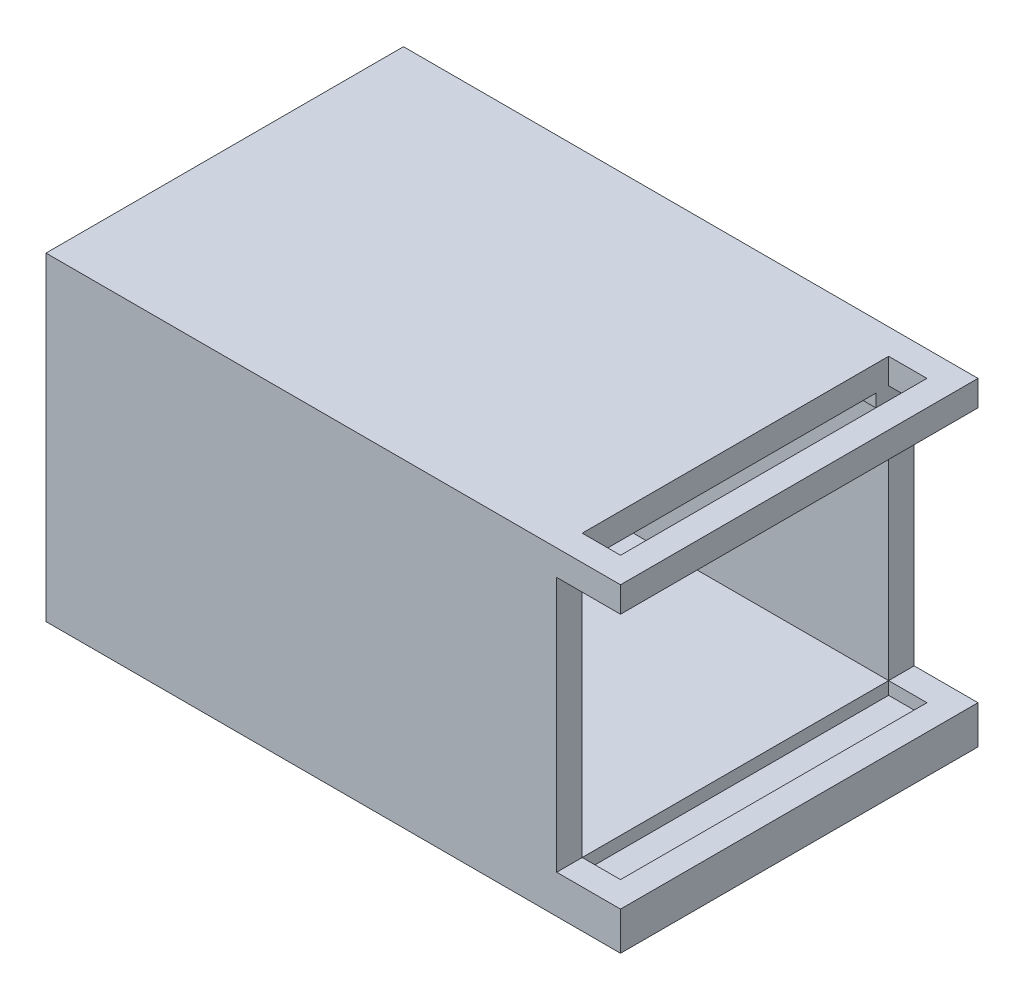
ISO-10303-21;
HEADER;
FILE_DESCRIPTION(('STEP AP214'),'2;1');
FILE_NAME('part.step','',(''),(''),'','','');
FILE_SCHEMA(('AUTOMOTIVE_DESIGN { 1 0 10303 214 1 1 1 1 }'));
ENDSEC;
DATA;
#1=APPLICATION_CONTEXT('core data for automotive mechanical design processes');
#2=APPLICATION_PROTOCOL_DEFINITION('international standard','automotive_design',2000,#1);
#3=PRODUCT_CONTEXT('',#1,'mechanical');
#4=PRODUCT('Part','Part','',(#3));
#5=PRODUCT_RELATED_PRODUCT_CATEGORY('part','',(#4));
#6=PRODUCT_DEFINITION_FORMATION('','',#4);
#7=PRODUCT_DEFINITION_CONTEXT('part definition',#1,'design');
#8=PRODUCT_DEFINITION('design','',#6,#7);
#9=PRODUCT_DEFINITION_SHAPE('','',#8);
#10=(LENGTH_UNIT() NAMED_UNIT(*) SI_UNIT(.MILLI.,.METRE.));
#11=(NAMED_UNIT(*) PLANE_ANGLE_UNIT() SI_UNIT($,.RADIAN.));
#12=(NAMED_UNIT(*) SI_UNIT($,.STERADIAN.) SOLID_ANGLE_UNIT());
#13=UNCERTAINTY_MEASURE_WITH_UNIT(LENGTH_MEASURE(1.E-05),#10,'distance_accuracy_value','');
#14=(GEOMETRIC_REPRESENTATION_CONTEXT(3) GLOBAL_UNCERTAINTY_ASSIGNED_CONTEXT((#13)) GLOBAL_UNIT_ASSIGNED_CONTEXT((#10,
#11,#12)) REPRESENTATION_CONTEXT('',''));
#15=CARTESIAN_POINT('',(0.,0.,0.));
#16=DIRECTION('',(0.,0.,1.));
#17=DIRECTION('',(1.,0.,0.));
#18=AXIS2_PLACEMENT_3D('',#15,#16,#17);
#19=CARTESIAN_POINT('',(0.,3.,0.));
#20=DIRECTION('',(0.,1.,0.));
#21=DIRECTION('',(0.,0.,1.));
#22=AXIS2_PLACEMENT_3D('',#19,#20,#21);
#23=PLANE('',#22);
#24=DIRECTION('',(0.,0.,-1.));
#25=VECTOR('',#24,1.);
#26=CARTESIAN_POINT('',(40.,3.,-26.));
#27=LINE('',#26,#25);
#28=CARTESIAN_POINT('',(40.,3.,-26.));
#29=VERTEX_POINT('',#28);
#30=CARTESIAN_POINT('',(40.,3.,-28.));
#31=VERTEX_POINT('',#30);
#32=EDGE_CURVE('E517',#29,#31,#27,.T.);
#33=ORIENTED_EDGE('',*,*,#32,.F.);
#34=DIRECTION('',(1.,0.,0.));
#35=VECTOR('',#34,1.);
#36=CARTESIAN_POINT('',(40.,3.,-26.));
#37=LINE('',#36,#35);
#38=CARTESIAN_POINT('',(43.,3.,-26.));
#39=VERTEX_POINT('',#38);
#40=EDGE_CURVE('E299',#29,#39,#37,.T.);
#41=ORIENTED_EDGE('',*,*,#40,.T.);
#42=DIRECTION('',(0.,0.,-1.));
#43=VECTOR('',#42,1.);
#44=CARTESIAN_POINT('',(43.,3.,-2.));
#45=LINE('',#44,#43);
#46=CARTESIAN_POINT('',(43.,3.,-2.));
#47=VERTEX_POINT('',#46);
#48=EDGE_CURVE('E286',#47,#39,#45,.T.);
#49=ORIENTED_EDGE('',*,*,#48,.F.);
#50=DIRECTION('',(1.,0.,0.));
#51=VECTOR('',#50,1.);
#52=CARTESIAN_POINT('',(40.,3.,-2.));
#53=LINE('',#52,#51);
#54=CARTESIAN_POINT('',(40.,3.,-2.));
#55=VERTEX_POINT('',#54);
#56=EDGE_CURVE('E302',#55,#47,#53,.T.);
#57=ORIENTED_EDGE('',*,*,#56,.F.);
#58=DIRECTION('',(0.,0.,1.));
#59=VECTOR('',#58,1.);
#60=CARTESIAN_POINT('',(40.,3.,-2.));
#61=LINE('',#60,#59);
#62=CARTESIAN_POINT('',(40.,3.,0.));
#63=VERTEX_POINT('',#62);
#64=EDGE_CURVE('E514',#55,#63,#61,.T.);
#65=ORIENTED_EDGE('',*,*,#64,.T.);
#66=DIRECTION('',(1.,0.,0.));
#67=VECTOR('',#66,1.);
#68=CARTESIAN_POINT('',(0.,3.,0.));
#69=LINE('',#68,#67);
#70=CARTESIAN_POINT('',(45.,3.,0.));
#71=VERTEX_POINT('',#70);
#72=EDGE_CURVE('E539',#63,#71,#69,.T.);
#73=ORIENTED_EDGE('',*,*,#72,.T.);
#74=DIRECTION('',(0.,0.,-1.));
#75=VECTOR('',#74,1.);
#76=CARTESIAN_POINT('',(45.,3.,0.));
#77=LINE('',#76,#75);
#78=CARTESIAN_POINT('',(45.,3.,-28.));
#79=VERTEX_POINT('',#78);
#80=EDGE_CURVE('E535',#71,#79,#77,.T.);
#81=ORIENTED_EDGE('',*,*,#80,.T.);
#82=DIRECTION('',(1.,0.,0.));
#83=VECTOR('',#82,1.);
#84=CARTESIAN_POINT('',(0.,3.,-28.));
#85=LINE('',#84,#83);
#86=EDGE_CURVE('E533',#31,#79,#85,.T.);
#87=ORIENTED_EDGE('',*,*,#86,.F.);
#88=EDGE_LOOP('',(#33,#41,#49,#57,#65,#73,#81,#87));
#89=FACE_BOUND('',#88,.T.);
#90=ADVANCED_FACE('F41',(#89),#23,.T.);
#91=DIRECTION('',(1.,0.,0.));
#92=VECTOR('',#91,1.);
#93=CARTESIAN_POINT('',(2.,3.,-2.));
#94=LINE('',#93,#92);
#95=CARTESIAN_POINT('',(2.,3.,-2.));
#96=VERTEX_POINT('',#95);
#97=EDGE_CURVE('E511',#96,#55,#94,.T.);
#98=ORIENTED_EDGE('',*,*,#97,.T.);
#99=DIRECTION('',(0.,0.,-1.));
#100=VECTOR('',#99,1.);
#101=CARTESIAN_POINT('',(40.,3.,-2.));
#102=LINE('',#101,#100);
#103=EDGE_CURVE('E279',#55,#29,#102,.T.);
#104=ORIENTED_EDGE('',*,*,#103,.T.);
#105=DIRECTION('',(1.,0.,0.));
#106=VECTOR('',#105,1.);
#107=CARTESIAN_POINT('',(2.,3.,-26.));
#108=LINE('',#107,#106);
#109=CARTESIAN_POINT('',(2.,3.,-26.));
#110=VERTEX_POINT('',#109);
#111=EDGE_CURVE('E503',#110,#29,#108,.T.);
#112=ORIENTED_EDGE('',*,*,#111,.F.);
#113=DIRECTION('',(0.,0.,1.));
#114=VECTOR('',#113,1.);
#115=CARTESIAN_POINT('',(2.,3.,-26.));
#116=LINE('',#115,#114);
#117=EDGE_CURVE('E499',#110,#96,#116,.T.);
#118=ORIENTED_EDGE('',*,*,#117,.T.);
#119=EDGE_LOOP('',(#98,#104,#112,#118));
#120=FACE_BOUND('',#119,.T.);
#121=ADVANCED_FACE('F606',(#120),#23,.T.);
#122=CARTESIAN_POINT('',(0.,23.,0.));
#123=DIRECTION('',(0.,1.,0.));
#124=DIRECTION('',(0.,0.,1.));
#125=AXIS2_PLACEMENT_3D('',#122,#123,#124);
#126=PLANE('',#125);
#127=DIRECTION('',(-1.,0.,0.));
#128=VECTOR('',#127,1.);
#129=CARTESIAN_POINT('',(40.,23.,-25.));
#130=LINE('',#129,#128);
#131=CARTESIAN_POINT('',(40.,23.,-25.));
#132=VERTEX_POINT('',#131);
#133=CARTESIAN_POINT('',(5.,23.,-25.));
#134=VERTEX_POINT('',#133);
#135=EDGE_CURVE('E288',#132,#134,#130,.T.);
#136=ORIENTED_EDGE('',*,*,#135,.F.);
#137=DIRECTION('',(0.,0.,1.));
#138=VECTOR('',#137,1.);
#139=CARTESIAN_POINT('',(40.,23.,-26.));
#140=LINE('',#139,#138);
#141=CARTESIAN_POINT('',(40.,23.,-3.));
#142=VERTEX_POINT('',#141);
#143=EDGE_CURVE('E447',#132,#142,#140,.T.);
#144=ORIENTED_EDGE('',*,*,#143,.T.);
#145=DIRECTION('',(1.,0.,0.));
#146=VECTOR('',#145,1.);
#147=CARTESIAN_POINT('',(40.,23.,-3.));
#148=LINE('',#147,#146);
#149=CARTESIAN_POINT('',(5.,23.,-3.));
#150=VERTEX_POINT('',#149);
#151=EDGE_CURVE('E315',#150,#142,#148,.T.);
#152=ORIENTED_EDGE('',*,*,#151,.F.);
#153=DIRECTION('',(0.,0.,1.));
#154=VECTOR('',#153,1.);
#155=CARTESIAN_POINT('',(5.,23.,-25.));
#156=LINE('',#155,#154);
#157=EDGE_CURVE('E334',#134,#150,#156,.T.);
#158=ORIENTED_EDGE('',*,*,#157,.F.);
#159=EDGE_LOOP('',(#136,#144,#152,#158));
#160=FACE_BOUND('',#159,.T.);
#161=ADVANCED_FACE('F630',(#160),#126,.F.);
#162=CARTESIAN_POINT('',(2.,25.,-26.));
#163=DIRECTION('',(1.,0.,0.));
#164=DIRECTION('',(0.,0.,-1.));
#165=AXIS2_PLACEMENT_3D('',#162,#163,#164);
#166=PLANE('',#165);
#167=DIRECTION('',(0.,0.,-1.));
#168=VECTOR('',#167,1.);
#169=CARTESIAN_POINT('',(2.,22.,-2.));
#170=LINE('',#169,#168);
#171=CARTESIAN_POINT('',(2.,22.,-2.));
#172=VERTEX_POINT('',#171);
#173=CARTESIAN_POINT('',(2.,22.,-26.));
#174=VERTEX_POINT('',#173);
#175=EDGE_CURVE('E327',#172,#174,#170,.T.);
#176=ORIENTED_EDGE('',*,*,#175,.F.);
#177=DIRECTION('',(0.,-1.,0.));
#178=VECTOR('',#177,1.);
#179=CARTESIAN_POINT('',(2.,25.,-2.));
#180=LINE('',#179,#178);
#181=EDGE_CURVE('E508',#172,#96,#180,.T.);
#182=ORIENTED_EDGE('',*,*,#181,.T.);
#183=ORIENTED_EDGE('',*,*,#117,.F.);
#184=DIRECTION('',(0.,-1.,0.));
#185=VECTOR('',#184,1.);
#186=CARTESIAN_POINT('',(2.,25.,-26.));
#187=LINE('',#186,#185);
#188=EDGE_CURVE('E521',#174,#110,#187,.T.);
#189=ORIENTED_EDGE('',*,*,#188,.F.);
#190=EDGE_LOOP('',(#176,#182,#183,#189));
#191=FACE_BOUND('',#190,.T.);
#192=CARTESIAN_POINT('',(2.,5.25,-17.22));
#193=DIRECTION('',(-1.,0.,0.));
#194=DIRECTION('',(0.,0.,1.));
#195=AXIS2_PLACEMENT_3D('',#192,#193,#194);
#196=CIRCLE('',#195,1.25);
#197=CARTESIAN_POINT('',(2.,5.25,-18.47));
#198=VERTEX_POINT('',#197);
#199=CARTESIAN_POINT('',(2.,4.,-17.22));
#200=VERTEX_POINT('',#199);
#201=EDGE_CURVE('E351',#198,#200,#196,.T.);
#202=ORIENTED_EDGE('',*,*,#201,.T.);
#203=DIRECTION('',(0.,0.,1.));
#204=VECTOR('',#203,1.);
#205=CARTESIAN_POINT('',(2.,4.,-17.22));
#206=LINE('',#205,#204);
#207=CARTESIAN_POINT('',(2.,4.,-10.78));
#208=VERTEX_POINT('',#207);
#209=EDGE_CURVE('E354',#200,#208,#206,.T.);
#210=ORIENTED_EDGE('',*,*,#209,.T.);
#211=CARTESIAN_POINT('',(2.,5.25,-10.78));
#212=DIRECTION('',(-1.,0.,0.));
#213=DIRECTION('',(0.,0.,1.));
#214=AXIS2_PLACEMENT_3D('',#211,#212,#213);
#215=CIRCLE('',#214,1.25);
#216=CARTESIAN_POINT('',(2.,5.25,-9.53));
#217=VERTEX_POINT('',#216);
#218=EDGE_CURVE('E358',#208,#217,#215,.T.);
#219=ORIENTED_EDGE('',*,*,#218,.T.);
#220=DIRECTION('',(0.,1.,0.));
#221=VECTOR('',#220,1.);
#222=CARTESIAN_POINT('',(2.,5.96,-9.53000000000001));
#223=LINE('',#222,#221);
#224=CARTESIAN_POINT('',(2.,5.96,-9.53000000000001));
#225=VERTEX_POINT('',#224);
#226=EDGE_CURVE('E361',#217,#225,#223,.T.);
#227=ORIENTED_EDGE('',*,*,#226,.T.);
#228=CARTESIAN_POINT('',(2.,5.96,-10.78));
#229=DIRECTION('',(-1.,0.,0.));
#230=DIRECTION('',(0.,0.,1.));
#231=AXIS2_PLACEMENT_3D('',#228,#229,#230);
#232=CIRCLE('',#231,1.25);
#233=CARTESIAN_POINT('',(2.,7.21,-10.78));
#234=VERTEX_POINT('',#233);
#235=EDGE_CURVE('E364',#225,#234,#232,.T.);
#236=ORIENTED_EDGE('',*,*,#235,.T.);
#237=DIRECTION('',(0.,0.,-1.));
#238=VECTOR('',#237,1.);
#239=CARTESIAN_POINT('',(2.,7.21,-17.22));
#240=LINE('',#239,#238);
#241=CARTESIAN_POINT('',(2.,7.21,-17.22));
#242=VERTEX_POINT('',#241);
#243=EDGE_CURVE('E367',#234,#242,#240,.T.);
#244=ORIENTED_EDGE('',*,*,#243,.T.);
#245=CARTESIAN_POINT('',(2.,5.96,-17.22));
#246=DIRECTION('',(-1.,0.,0.));
#247=DIRECTION('',(0.,0.,1.));
#248=AXIS2_PLACEMENT_3D('',#245,#246,#247);
#249=CIRCLE('',#248,1.25);
#250=CARTESIAN_POINT('',(2.,5.96,-18.47));
#251=VERTEX_POINT('',#250);
#252=EDGE_CURVE('E370',#242,#251,#249,.T.);
#253=ORIENTED_EDGE('',*,*,#252,.T.);
#254=DIRECTION('',(0.,-1.,0.));
#255=VECTOR('',#254,1.);
#256=CARTESIAN_POINT('',(2.,5.25,-18.47));
#257=LINE('',#256,#255);
#258=EDGE_CURVE('E373',#251,#198,#257,.T.);
#259=ORIENTED_EDGE('',*,*,#258,.T.);
#260=EDGE_LOOP('',(#202,#210,#219,#227,#236,#244,#253,#259));
#261=FACE_BOUND('',#260,.T.);
#262=DIRECTION('',(0.,-1.,0.));
#263=VECTOR('',#262,1.);
#264=CARTESIAN_POINT('',(2.,12.,-18.25));
#265=LINE('',#264,#263);
#266=CARTESIAN_POINT('',(2.,12.,-18.25));
#267=VERTEX_POINT('',#266);
#268=CARTESIAN_POINT('',(2.,8.5,-18.25));
#269=VERTEX_POINT('',#268);
#270=EDGE_CURVE('E430',#267,#269,#265,.T.);
#271=ORIENTED_EDGE('',*,*,#270,.T.);
#272=DIRECTION('',(0.,0.,1.));
#273=VECTOR('',#272,1.);
#274=CARTESIAN_POINT('',(2.,8.5,-18.25));
#275=LINE('',#274,#273);
#276=CARTESIAN_POINT('',(2.,8.5,-9.75000000000001));
#277=VERTEX_POINT('',#276);
#278=EDGE_CURVE('E442',#269,#277,#275,.T.);
#279=ORIENTED_EDGE('',*,*,#278,.T.);
#280=DIRECTION('',(0.,1.,0.));
#281=VECTOR('',#280,1.);
#282=CARTESIAN_POINT('',(2.,12.,-9.75000000000001));
#283=LINE('',#282,#281);
#284=CARTESIAN_POINT('',(2.,12.,-9.75000000000001));
#285=VERTEX_POINT('',#284);
#286=EDGE_CURVE('E439',#277,#285,#283,.T.);
#287=ORIENTED_EDGE('',*,*,#286,.T.);
#288=DIRECTION('',(0.,0.,-1.));
#289=VECTOR('',#288,1.);
#290=CARTESIAN_POINT('',(2.,12.,-18.25));
#291=LINE('',#290,#289);
#292=EDGE_CURVE('E420',#285,#267,#291,.T.);
#293=ORIENTED_EDGE('',*,*,#292,.T.);
#294=EDGE_LOOP('',(#271,#279,#287,#293));
#295=FACE_BOUND('',#294,.T.);
#296=ADVANCED_FACE('F598',(#191,#261,#295),#166,.T.);
#297=CARTESIAN_POINT('',(2.,25.,-26.));
#298=DIRECTION('',(0.,0.,-1.));
#299=DIRECTION('',(-1.,0.,0.));
#300=AXIS2_PLACEMENT_3D('',#297,#298,#299);
#301=PLANE('',#300);
#302=DIRECTION('',(0.,-1.,0.));
#303=VECTOR('',#302,1.);
#304=CARTESIAN_POINT('',(40.,25.,-26.));
#305=LINE('',#304,#303);
#306=CARTESIAN_POINT('',(40.,22.,-26.));
#307=VERTEX_POINT('',#306);
#308=EDGE_CURVE('E63',#307,#29,#305,.T.);
#309=ORIENTED_EDGE('',*,*,#308,.F.);
#310=DIRECTION('',(1.,0.,0.));
#311=VECTOR('',#310,1.);
#312=CARTESIAN_POINT('',(2.,22.,-26.));
#313=LINE('',#312,#311);
#314=EDGE_CURVE('E58',#174,#307,#313,.T.);
#315=ORIENTED_EDGE('',*,*,#314,.F.);
#316=ORIENTED_EDGE('',*,*,#188,.T.);
#317=ORIENTED_EDGE('',*,*,#111,.T.);
#318=EDGE_LOOP('',(#309,#315,#316,#317));
#319=FACE_BOUND('',#318,.T.);
#320=ADVANCED_FACE('F826',(#319),#301,.F.);
#321=CARTESIAN_POINT('',(40.,25.,-2.));
#322=DIRECTION('',(1.,0.,0.));
#323=DIRECTION('',(0.,0.,-1.));
#324=AXIS2_PLACEMENT_3D('',#321,#322,#323);
#325=PLANE('',#324);
#326=DIRECTION('',(0.,-1.,0.));
#327=VECTOR('',#326,1.);
#328=CARTESIAN_POINT('',(40.,25.,-2.));
#329=LINE('',#328,#327);
#330=CARTESIAN_POINT('',(40.,22.,-2.));
#331=VERTEX_POINT('',#330);
#332=EDGE_CURVE('E529',#331,#55,#329,.T.);
#333=ORIENTED_EDGE('',*,*,#332,.F.);
#334=DIRECTION('',(0.,0.,1.));
#335=VECTOR('',#334,1.);
#336=CARTESIAN_POINT('',(40.,22.,-2.));
#337=LINE('',#336,#335);
#338=CARTESIAN_POINT('',(40.,22.,-3.));
#339=VERTEX_POINT('',#338);
#340=EDGE_CURVE('E321',#339,#331,#337,.T.);
#341=ORIENTED_EDGE('',*,*,#340,.F.);
#342=DIRECTION('',(0.,1.,0.));
#343=VECTOR('',#342,1.);
#344=CARTESIAN_POINT('',(40.,22.,-3.));
#345=LINE('',#344,#343);
#346=EDGE_CURVE('E331',#339,#142,#345,.T.);
#347=ORIENTED_EDGE('',*,*,#346,.T.);
#348=ORIENTED_EDGE('',*,*,#143,.F.);
#349=DIRECTION('',(0.,1.,0.));
#350=VECTOR('',#349,1.);
#351=CARTESIAN_POINT('',(40.,22.,-25.));
#352=LINE('',#351,#350);
#353=CARTESIAN_POINT('',(40.,22.,-25.));
#354=VERTEX_POINT('',#353);
#355=EDGE_CURVE('E347',#354,#132,#352,.T.);
#356=ORIENTED_EDGE('',*,*,#355,.F.);
#357=DIRECTION('',(0.,0.,1.));
#358=VECTOR('',#357,1.);
#359=CARTESIAN_POINT('',(40.,22.,-25.));
#360=LINE('',#359,#358);
#361=EDGE_CURVE('E311',#307,#354,#360,.T.);
#362=ORIENTED_EDGE('',*,*,#361,.F.);
#363=ORIENTED_EDGE('',*,*,#308,.T.);
#364=ORIENTED_EDGE('',*,*,#32,.T.);
#365=DIRECTION('',(0.,-1.,0.));
#366=VECTOR('',#365,1.);
#367=CARTESIAN_POINT('',(40.,25.,-28.));
#368=LINE('',#367,#366);
#369=CARTESIAN_POINT('',(40.,23.,-28.));
#370=VERTEX_POINT('',#369);
#371=EDGE_CURVE('E525',#370,#31,#368,.T.);
#372=ORIENTED_EDGE('',*,*,#371,.F.);
#373=DIRECTION('',(0.,0.,-1.));
#374=VECTOR('',#373,1.);
#375=CARTESIAN_POINT('',(40.,23.,-26.));
#376=LINE('',#375,#374);
#377=CARTESIAN_POINT('',(40.,23.,-26.));
#378=VERTEX_POINT('',#377);
#379=EDGE_CURVE('E496',#378,#370,#376,.T.);
#380=ORIENTED_EDGE('',*,*,#379,.F.);
#381=DIRECTION('',(0.,1.,0.));
#382=VECTOR('',#381,1.);
#383=CARTESIAN_POINT('',(40.,23.,-26.));
#384=LINE('',#383,#382);
#385=CARTESIAN_POINT('',(40.,25.,-26.));
#386=VERTEX_POINT('',#385);
#387=EDGE_CURVE('E469',#378,#386,#384,.T.);
#388=ORIENTED_EDGE('',*,*,#387,.T.);
#389=DIRECTION('',(0.,0.,1.));
#390=VECTOR('',#389,1.);
#391=CARTESIAN_POINT('',(40.,25.,-26.));
#392=LINE('',#391,#390);
#393=CARTESIAN_POINT('',(40.,25.,-2.));
#394=VERTEX_POINT('',#393);
#395=EDGE_CURVE('E402',#386,#394,#392,.T.);
#396=ORIENTED_EDGE('',*,*,#395,.T.);
#397=DIRECTION('',(0.,1.,0.));
#398=VECTOR('',#397,1.);
#399=CARTESIAN_POINT('',(40.,23.,-2.));
#400=LINE('',#399,#398);
#401=CARTESIAN_POINT('',(40.,23.,-2.));
#402=VERTEX_POINT('',#401);
#403=EDGE_CURVE('E459',#402,#394,#400,.T.);
#404=ORIENTED_EDGE('',*,*,#403,.F.);
#405=DIRECTION('',(0.,0.,1.));
#406=VECTOR('',#405,1.);
#407=CARTESIAN_POINT('',(40.,23.,-2.));
#408=LINE('',#407,#406);
#409=CARTESIAN_POINT('',(40.,23.,0.));
#410=VERTEX_POINT('',#409);
#411=EDGE_CURVE('E492',#402,#410,#408,.T.);
#412=ORIENTED_EDGE('',*,*,#411,.T.);
#413=DIRECTION('',(0.,-1.,0.));
#414=VECTOR('',#413,1.);
#415=CARTESIAN_POINT('',(40.,25.,0.));
#416=LINE('',#415,#414);
#417=EDGE_CURVE('E527',#410,#63,#416,.T.);
#418=ORIENTED_EDGE('',*,*,#417,.T.);
#419=ORIENTED_EDGE('',*,*,#64,.F.);
#420=EDGE_LOOP('',(#333,#341,#347,#348,#356,#362,#363,#364,#372,#380,#388,#396,#404,#412,#418,#419));
#421=FACE_BOUND('',#420,.T.);
#422=ADVANCED_FACE('F589',(#421),#325,.T.);
#423=CARTESIAN_POINT('',(2.,25.,-2.));
#424=DIRECTION('',(0.,0.,-1.));
#425=DIRECTION('',(-1.,0.,0.));
#426=AXIS2_PLACEMENT_3D('',#423,#424,#425);
#427=PLANE('',#426);
#428=DIRECTION('',(-1.,0.,0.));
#429=VECTOR('',#428,1.);
#430=CARTESIAN_POINT('',(2.,22.,-2.));
#431=LINE('',#430,#429);
#432=EDGE_CURVE('E324',#331,#172,#431,.T.);
#433=ORIENTED_EDGE('',*,*,#432,.F.);
#434=ORIENTED_EDGE('',*,*,#332,.T.);
#435=ORIENTED_EDGE('',*,*,#97,.F.);
#436=ORIENTED_EDGE('',*,*,#181,.F.);
#437=EDGE_LOOP('',(#433,#434,#435,#436));
#438=FACE_BOUND('',#437,.T.);
#439=ADVANCED_FACE('F603',(#438),#427,.T.);
#440=CARTESIAN_POINT('',(0.,3.,-28.));
#441=DIRECTION('',(0.,0.,-1.));
#442=DIRECTION('',(-1.,0.,0.));
#443=AXIS2_PLACEMENT_3D('',#440,#441,#442);
#444=PLANE('',#443);
#445=DIRECTION('',(-1.,0.,0.));
#446=VECTOR('',#445,1.);
#447=CARTESIAN_POINT('',(0.,23.,-28.));
#448=LINE('',#447,#446);
#449=CARTESIAN_POINT('',(45.,23.,-28.));
#450=VERTEX_POINT('',#449);
#451=EDGE_CURVE('E483',#450,#370,#448,.T.);
#452=ORIENTED_EDGE('',*,*,#451,.T.);
#453=ORIENTED_EDGE('',*,*,#371,.T.);
#454=ORIENTED_EDGE('',*,*,#86,.T.);
#455=DIRECTION('',(0.,-1.,0.));
#456=VECTOR('',#455,1.);
#457=CARTESIAN_POINT('',(45.,3.,-28.));
#458=LINE('',#457,#456);
#459=CARTESIAN_POINT('',(45.,0.,-28.));
#460=VERTEX_POINT('',#459);
#461=EDGE_CURVE('E45',#79,#460,#458,.T.);
#462=ORIENTED_EDGE('',*,*,#461,.T.);
#463=DIRECTION('',(1.,0.,0.));
#464=VECTOR('',#463,1.);
#465=CARTESIAN_POINT('',(0.,0.,-28.));
#466=LINE('',#465,#464);
#467=CARTESIAN_POINT('',(0.,0.,-28.));
#468=VERTEX_POINT('',#467);
#469=EDGE_CURVE('E523',#468,#460,#466,.T.);
#470=ORIENTED_EDGE('',*,*,#469,.F.);
#471=DIRECTION('',(0.,-1.,0.));
#472=VECTOR('',#471,1.);
#473=CARTESIAN_POINT('',(0.,3.,-28.));
#474=LINE('',#473,#472);
#475=CARTESIAN_POINT('',(0.,25.,-28.));
#476=VERTEX_POINT('',#475);
#477=EDGE_CURVE('E11',#476,#468,#474,.T.);
#478=ORIENTED_EDGE('',*,*,#477,.F.);
#479=DIRECTION('',(1.,0.,0.));
#480=VECTOR('',#479,1.);
#481=CARTESIAN_POINT('',(0.,25.,-28.));
#482=LINE('',#481,#480);
#483=CARTESIAN_POINT('',(45.,25.,-28.));
#484=VERTEX_POINT('',#483);
#485=EDGE_CURVE('E506',#476,#484,#482,.T.);
#486=ORIENTED_EDGE('',*,*,#485,.T.);
#487=DIRECTION('',(0.,1.,0.));
#488=VECTOR('',#487,1.);
#489=CARTESIAN_POINT('',(45.,23.,-28.));
#490=LINE('',#489,#488);
#491=EDGE_CURVE('E489',#450,#484,#490,.T.);
#492=ORIENTED_EDGE('',*,*,#491,.F.);
#493=EDGE_LOOP('',(#452,#453,#454,#462,#470,#478,#486,#492));
#494=FACE_BOUND('',#493,.T.);
#495=ADVANCED_FACE('F43',(#494),#444,.T.);
#496=CARTESIAN_POINT('',(0.,3.,0.));
#497=DIRECTION('',(-1.,0.,0.));
#498=DIRECTION('',(0.,0.,1.));
#499=AXIS2_PLACEMENT_3D('',#496,#497,#498);
#500=PLANE('',#499);
#501=CARTESIAN_POINT('',(0.,5.25,-17.22));
#502=DIRECTION('',(-1.,0.,0.));
#503=DIRECTION('',(0.,0.,1.));
#504=AXIS2_PLACEMENT_3D('',#501,#502,#503);
#505=CIRCLE('',#504,1.25);
#506=CARTESIAN_POINT('',(0.,5.25,-18.47));
#507=VERTEX_POINT('',#506);
#508=CARTESIAN_POINT('',(0.,4.,-17.22));
#509=VERTEX_POINT('',#508);
#510=EDGE_CURVE('E377',#507,#509,#505,.T.);
#511=ORIENTED_EDGE('',*,*,#510,.F.);
#512=DIRECTION('',(0.,-1.,0.));
#513=VECTOR('',#512,1.);
#514=CARTESIAN_POINT('',(0.,5.25,-18.47));
#515=LINE('',#514,#513);
#516=CARTESIAN_POINT('',(0.,5.96,-18.47));
#517=VERTEX_POINT('',#516);
#518=EDGE_CURVE('E355',#517,#507,#515,.T.);
#519=ORIENTED_EDGE('',*,*,#518,.F.);
#520=CARTESIAN_POINT('',(0.,5.96,-17.22));
#521=DIRECTION('',(-1.,0.,0.));
#522=DIRECTION('',(0.,0.,1.));
#523=AXIS2_PLACEMENT_3D('',#520,#521,#522);
#524=CIRCLE('',#523,1.25);
#525=CARTESIAN_POINT('',(0.,7.21,-17.22));
#526=VERTEX_POINT('',#525);
#527=EDGE_CURVE('E395',#526,#517,#524,.T.);
#528=ORIENTED_EDGE('',*,*,#527,.F.);
#529=DIRECTION('',(0.,0.,-1.));
#530=VECTOR('',#529,1.);
#531=CARTESIAN_POINT('',(0.,7.21,-17.22));
#532=LINE('',#531,#530);
#533=CARTESIAN_POINT('',(0.,7.21,-10.78));
#534=VERTEX_POINT('',#533);
#535=EDGE_CURVE('E392',#534,#526,#532,.T.);
#536=ORIENTED_EDGE('',*,*,#535,.F.);
#537=CARTESIAN_POINT('',(0.,5.96,-10.78));
#538=DIRECTION('',(-1.,0.,0.));
#539=DIRECTION('',(0.,0.,1.));
#540=AXIS2_PLACEMENT_3D('',#537,#538,#539);
#541=CIRCLE('',#540,1.25);
#542=CARTESIAN_POINT('',(0.,5.96,-9.53000000000001));
#543=VERTEX_POINT('',#542);
#544=EDGE_CURVE('E389',#543,#534,#541,.T.);
#545=ORIENTED_EDGE('',*,*,#544,.F.);
#546=DIRECTION('',(0.,1.,0.));
#547=VECTOR('',#546,1.);
#548=CARTESIAN_POINT('',(0.,5.96,-9.53000000000001));
#549=LINE('',#548,#547);
#550=CARTESIAN_POINT('',(0.,5.25,-9.53));
#551=VERTEX_POINT('',#550);
#552=EDGE_CURVE('E386',#551,#543,#549,.T.);
#553=ORIENTED_EDGE('',*,*,#552,.F.);
#554=CARTESIAN_POINT('',(0.,5.25,-10.78));
#555=DIRECTION('',(-1.,0.,0.));
#556=DIRECTION('',(0.,0.,1.));
#557=AXIS2_PLACEMENT_3D('',#554,#555,#556);
#558=CIRCLE('',#557,1.25);
#559=CARTESIAN_POINT('',(0.,4.,-10.78));
#560=VERTEX_POINT('',#559);
#561=EDGE_CURVE('E383',#560,#551,#558,.T.);
#562=ORIENTED_EDGE('',*,*,#561,.F.);
#563=DIRECTION('',(0.,0.,1.));
#564=VECTOR('',#563,1.);
#565=CARTESIAN_POINT('',(0.,4.,-17.22));
#566=LINE('',#565,#564);
#567=EDGE_CURVE('E379',#509,#560,#566,.T.);
#568=ORIENTED_EDGE('',*,*,#567,.F.);
#569=EDGE_LOOP('',(#511,#519,#528,#536,#545,#553,#562,#568));
#570=FACE_BOUND('',#569,.T.);
#571=DIRECTION('',(0.,-1.,0.));
#572=VECTOR('',#571,1.);
#573=CARTESIAN_POINT('',(0.,12.,-18.25));
#574=LINE('',#573,#572);
#575=CARTESIAN_POINT('',(0.,12.,-18.25));
#576=VERTEX_POINT('',#575);
#577=CARTESIAN_POINT('',(0.,8.5,-18.25));
#578=VERTEX_POINT('',#577);
#579=EDGE_CURVE('E380',#576,#578,#574,.T.);
#580=ORIENTED_EDGE('',*,*,#579,.F.);
#581=DIRECTION('',(0.,0.,-1.));
#582=VECTOR('',#581,1.);
#583=CARTESIAN_POINT('',(0.,12.,-18.25));
#584=LINE('',#583,#582);
#585=CARTESIAN_POINT('',(0.,12.,-9.75000000000001));
#586=VERTEX_POINT('',#585);
#587=EDGE_CURVE('E426',#586,#576,#584,.T.);
#588=ORIENTED_EDGE('',*,*,#587,.F.);
#589=DIRECTION('',(0.,1.,0.));
#590=VECTOR('',#589,1.);
#591=CARTESIAN_POINT('',(0.,12.,-9.75000000000001));
#592=LINE('',#591,#590);
#593=CARTESIAN_POINT('',(0.,8.5,-9.75000000000001));
#594=VERTEX_POINT('',#593);
#595=EDGE_CURVE('E429',#594,#586,#592,.T.);
#596=ORIENTED_EDGE('',*,*,#595,.F.);
#597=DIRECTION('',(0.,0.,1.));
#598=VECTOR('',#597,1.);
#599=CARTESIAN_POINT('',(0.,8.5,-18.25));
#600=LINE('',#599,#598);
#601=EDGE_CURVE('E433',#578,#594,#600,.T.);
#602=ORIENTED_EDGE('',*,*,#601,.F.);
#603=EDGE_LOOP('',(#580,#588,#596,#602));
#604=FACE_BOUND('',#603,.T.);
#605=ORIENTED_EDGE('',*,*,#477,.T.);
#606=DIRECTION('',(0.,0.,-1.));
#607=VECTOR('',#606,1.);
#608=CARTESIAN_POINT('',(0.,0.,0.));
#609=LINE('',#608,#607);
#610=CARTESIAN_POINT('',(0.,0.,0.));
#611=VERTEX_POINT('',#610);
#612=EDGE_CURVE('E536',#611,#468,#609,.T.);
#613=ORIENTED_EDGE('',*,*,#612,.F.);
#614=DIRECTION('',(0.,-1.,0.));
#615=VECTOR('',#614,1.);
#616=CARTESIAN_POINT('',(0.,3.,0.));
#617=LINE('',#616,#615);
#618=CARTESIAN_POINT('',(0.,25.,0.));
#619=VERTEX_POINT('',#618);
#620=EDGE_CURVE('E50',#619,#611,#617,.T.);
#621=ORIENTED_EDGE('',*,*,#620,.F.);
#622=DIRECTION('',(0.,0.,1.));
#623=VECTOR('',#622,1.);
#624=CARTESIAN_POINT('',(0.,25.,-28.));
#625=LINE('',#624,#623);
#626=EDGE_CURVE('E502',#476,#619,#625,.T.);
#627=ORIENTED_EDGE('',*,*,#626,.F.);
#628=EDGE_LOOP('',(#605,#613,#621,#627));
#629=FACE_BOUND('',#628,.T.);
#630=ADVANCED_FACE('F566',(#570,#604,#629),#500,.T.);
#631=CARTESIAN_POINT('',(0.,3.,0.));
#632=DIRECTION('',(0.,0.,-1.));
#633=DIRECTION('',(-1.,0.,0.));
#634=AXIS2_PLACEMENT_3D('',#631,#632,#633);
#635=PLANE('',#634);
#636=ORIENTED_EDGE('',*,*,#620,.T.);
#637=DIRECTION('',(1.,0.,0.));
#638=VECTOR('',#637,1.);
#639=CARTESIAN_POINT('',(0.,0.,0.));
#640=LINE('',#639,#638);
#641=CARTESIAN_POINT('',(45.,0.,0.));
#642=VERTEX_POINT('',#641);
#643=EDGE_CURVE('E546',#611,#642,#640,.T.);
#644=ORIENTED_EDGE('',*,*,#643,.T.);
#645=DIRECTION('',(0.,-1.,0.));
#646=VECTOR('',#645,1.);
#647=CARTESIAN_POINT('',(45.,3.,0.));
#648=LINE('',#647,#646);
#649=EDGE_CURVE('E550',#71,#642,#648,.T.);
#650=ORIENTED_EDGE('',*,*,#649,.F.);
#651=ORIENTED_EDGE('',*,*,#72,.F.);
#652=ORIENTED_EDGE('',*,*,#417,.F.);
#653=DIRECTION('',(1.,0.,0.));
#654=VECTOR('',#653,1.);
#655=CARTESIAN_POINT('',(0.,23.,0.));
#656=LINE('',#655,#654);
#657=CARTESIAN_POINT('',(45.,23.,0.));
#658=VERTEX_POINT('',#657);
#659=EDGE_CURVE('E478',#410,#658,#656,.T.);
#660=ORIENTED_EDGE('',*,*,#659,.T.);
#661=DIRECTION('',(0.,1.,0.));
#662=VECTOR('',#661,1.);
#663=CARTESIAN_POINT('',(45.,23.,0.));
#664=LINE('',#663,#662);
#665=CARTESIAN_POINT('',(45.,25.,0.));
#666=VERTEX_POINT('',#665);
#667=EDGE_CURVE('E486',#658,#666,#664,.T.);
#668=ORIENTED_EDGE('',*,*,#667,.T.);
#669=DIRECTION('',(1.,0.,0.));
#670=VECTOR('',#669,1.);
#671=CARTESIAN_POINT('',(0.,25.,0.));
#672=LINE('',#671,#670);
#673=EDGE_CURVE('E500',#619,#666,#672,.T.);
#674=ORIENTED_EDGE('',*,*,#673,.F.);
#675=EDGE_LOOP('',(#636,#644,#650,#651,#652,#660,#668,#674));
#676=FACE_BOUND('',#675,.T.);
#677=ADVANCED_FACE('F579',(#676),#635,.F.);
#678=CARTESIAN_POINT('',(45.,3.,0.));
#679=DIRECTION('',(-1.,0.,0.));
#680=DIRECTION('',(0.,0.,1.));
#681=AXIS2_PLACEMENT_3D('',#678,#679,#680);
#682=PLANE('',#681);
#683=DIRECTION('',(0.,0.,-1.));
#684=VECTOR('',#683,1.);
#685=CARTESIAN_POINT('',(45.,0.,0.));
#686=LINE('',#685,#684);
#687=EDGE_CURVE('E543',#642,#460,#686,.T.);
#688=ORIENTED_EDGE('',*,*,#687,.T.);
#689=ORIENTED_EDGE('',*,*,#461,.F.);
#690=ORIENTED_EDGE('',*,*,#80,.F.);
#691=ORIENTED_EDGE('',*,*,#649,.T.);
#692=EDGE_LOOP('',(#688,#689,#690,#691));
#693=FACE_BOUND('',#692,.T.);
#694=ADVANCED_FACE('F560',(#693),#682,.F.);
#695=CARTESIAN_POINT('',(0.,0.,0.));
#696=DIRECTION('',(0.,1.,0.));
#697=DIRECTION('',(0.,0.,1.));
#698=AXIS2_PLACEMENT_3D('',#695,#696,#697);
#699=PLANE('',#698);
#700=ORIENTED_EDGE('',*,*,#469,.T.);
#701=ORIENTED_EDGE('',*,*,#687,.F.);
#702=ORIENTED_EDGE('',*,*,#643,.F.);
#703=ORIENTED_EDGE('',*,*,#612,.T.);
#704=EDGE_LOOP('',(#700,#701,#702,#703));
#705=FACE_BOUND('',#704,.T.);
#706=ADVANCED_FACE('F563',(#705),#699,.F.);
#707=CARTESIAN_POINT('',(0.,25.,0.));
#708=DIRECTION('',(0.,1.,0.));
#709=DIRECTION('',(0.,0.,1.));
#710=AXIS2_PLACEMENT_3D('',#707,#708,#709);
#711=PLANE('',#710);
#712=ORIENTED_EDGE('',*,*,#395,.F.);
#713=DIRECTION('',(-1.,0.,0.));
#714=VECTOR('',#713,1.);
#715=CARTESIAN_POINT('',(40.,25.,-26.));
#716=LINE('',#715,#714);
#717=CARTESIAN_POINT('',(43.,25.,-26.));
#718=VERTEX_POINT('',#717);
#719=EDGE_CURVE('E450',#718,#386,#716,.T.);
#720=ORIENTED_EDGE('',*,*,#719,.F.);
#721=DIRECTION('',(0.,0.,-1.));
#722=VECTOR('',#721,1.);
#723=CARTESIAN_POINT('',(43.,25.,-26.));
#724=LINE('',#723,#722);
#725=CARTESIAN_POINT('',(43.,25.,-2.));
#726=VERTEX_POINT('',#725);
#727=EDGE_CURVE('E464',#726,#718,#724,.T.);
#728=ORIENTED_EDGE('',*,*,#727,.F.);
#729=DIRECTION('',(1.,0.,0.));
#730=VECTOR('',#729,1.);
#731=CARTESIAN_POINT('',(40.,25.,-2.));
#732=LINE('',#731,#730);
#733=EDGE_CURVE('E461',#394,#726,#732,.T.);
#734=ORIENTED_EDGE('',*,*,#733,.F.);
#735=EDGE_LOOP('',(#712,#720,#728,#734));
#736=FACE_BOUND('',#735,.T.);
#737=DIRECTION('',(0.,0.,-1.));
#738=VECTOR('',#737,1.);
#739=CARTESIAN_POINT('',(45.,25.,-28.));
#740=LINE('',#739,#738);
#741=EDGE_CURVE('E471',#666,#484,#740,.T.);
#742=ORIENTED_EDGE('',*,*,#741,.T.);
#743=ORIENTED_EDGE('',*,*,#485,.F.);
#744=ORIENTED_EDGE('',*,*,#626,.T.);
#745=ORIENTED_EDGE('',*,*,#673,.T.);
#746=EDGE_LOOP('',(#742,#743,#744,#745));
#747=FACE_BOUND('',#746,.T.);
#748=ADVANCED_FACE('F576',(#736,#747),#711,.T.);
#749=DIRECTION('',(-1.,0.,0.));
#750=VECTOR('',#749,1.);
#751=CARTESIAN_POINT('',(40.,23.,-26.));
#752=LINE('',#751,#750);
#753=CARTESIAN_POINT('',(43.,23.,-26.));
#754=VERTEX_POINT('',#753);
#755=EDGE_CURVE('E456',#754,#378,#752,.T.);
#756=ORIENTED_EDGE('',*,*,#755,.T.);
#757=ORIENTED_EDGE('',*,*,#379,.T.);
#758=ORIENTED_EDGE('',*,*,#451,.F.);
#759=DIRECTION('',(0.,0.,-1.));
#760=VECTOR('',#759,1.);
#761=CARTESIAN_POINT('',(45.,23.,-28.));
#762=LINE('',#761,#760);
#763=EDGE_CURVE('E480',#658,#450,#762,.T.);
#764=ORIENTED_EDGE('',*,*,#763,.F.);
#765=ORIENTED_EDGE('',*,*,#659,.F.);
#766=ORIENTED_EDGE('',*,*,#411,.F.);
#767=DIRECTION('',(1.,0.,0.));
#768=VECTOR('',#767,1.);
#769=CARTESIAN_POINT('',(40.,23.,-2.));
#770=LINE('',#769,#768);
#771=CARTESIAN_POINT('',(43.,23.,-2.));
#772=VERTEX_POINT('',#771);
#773=EDGE_CURVE('E449',#402,#772,#770,.T.);
#774=ORIENTED_EDGE('',*,*,#773,.T.);
#775=DIRECTION('',(0.,0.,-1.));
#776=VECTOR('',#775,1.);
#777=CARTESIAN_POINT('',(43.,23.,-26.));
#778=LINE('',#777,#776);
#779=EDGE_CURVE('E453',#772,#754,#778,.T.);
#780=ORIENTED_EDGE('',*,*,#779,.T.);
#781=EDGE_LOOP('',(#756,#757,#758,#764,#765,#766,#774,#780));
#782=FACE_BOUND('',#781,.T.);
#783=ADVANCED_FACE('F583',(#782),#126,.F.);
#784=CARTESIAN_POINT('',(45.,23.,-28.));
#785=DIRECTION('',(1.,0.,0.));
#786=DIRECTION('',(0.,0.,-1.));
#787=AXIS2_PLACEMENT_3D('',#784,#785,#786);
#788=PLANE('',#787);
#789=ORIENTED_EDGE('',*,*,#741,.F.);
#790=ORIENTED_EDGE('',*,*,#667,.F.);
#791=ORIENTED_EDGE('',*,*,#763,.T.);
#792=ORIENTED_EDGE('',*,*,#491,.T.);
#793=EDGE_LOOP('',(#789,#790,#791,#792));
#794=FACE_BOUND('',#793,.T.);
#795=ADVANCED_FACE('F572',(#794),#788,.T.);
#796=CARTESIAN_POINT('',(40.,23.,-26.));
#797=DIRECTION('',(0.,0.,-1.));
#798=DIRECTION('',(-1.,0.,0.));
#799=AXIS2_PLACEMENT_3D('',#796,#797,#798);
#800=PLANE('',#799);
#801=ORIENTED_EDGE('',*,*,#719,.T.);
#802=ORIENTED_EDGE('',*,*,#387,.F.);
#803=ORIENTED_EDGE('',*,*,#755,.F.);
#804=DIRECTION('',(0.,1.,0.));
#805=VECTOR('',#804,1.);
#806=CARTESIAN_POINT('',(43.,23.,-26.));
#807=LINE('',#806,#805);
#808=EDGE_CURVE('E472',#754,#718,#807,.T.);
#809=ORIENTED_EDGE('',*,*,#808,.T.);
#810=EDGE_LOOP('',(#801,#802,#803,#809));
#811=FACE_BOUND('',#810,.T.);
#812=ADVANCED_FACE('F677',(#811),#800,.F.);
#813=CARTESIAN_POINT('',(43.,23.,-26.));
#814=DIRECTION('',(1.,0.,0.));
#815=DIRECTION('',(0.,0.,-1.));
#816=AXIS2_PLACEMENT_3D('',#813,#814,#815);
#817=PLANE('',#816);
#818=ORIENTED_EDGE('',*,*,#727,.T.);
#819=ORIENTED_EDGE('',*,*,#808,.F.);
#820=ORIENTED_EDGE('',*,*,#779,.F.);
#821=DIRECTION('',(0.,1.,0.));
#822=VECTOR('',#821,1.);
#823=CARTESIAN_POINT('',(43.,23.,-2.));
#824=LINE('',#823,#822);
#825=EDGE_CURVE('E474',#772,#726,#824,.T.);
#826=ORIENTED_EDGE('',*,*,#825,.T.);
#827=EDGE_LOOP('',(#818,#819,#820,#826));
#828=FACE_BOUND('',#827,.T.);
#829=ADVANCED_FACE('F683',(#828),#817,.F.);
#830=CARTESIAN_POINT('',(40.,23.,-2.));
#831=DIRECTION('',(0.,0.,1.));
#832=DIRECTION('',(1.,0.,0.));
#833=AXIS2_PLACEMENT_3D('',#830,#831,#832);
#834=PLANE('',#833);
#835=ORIENTED_EDGE('',*,*,#733,.T.);
#836=ORIENTED_EDGE('',*,*,#825,.F.);
#837=ORIENTED_EDGE('',*,*,#773,.F.);
#838=ORIENTED_EDGE('',*,*,#403,.T.);
#839=EDGE_LOOP('',(#835,#836,#837,#838));
#840=FACE_BOUND('',#839,.T.);
#841=ADVANCED_FACE('F687',(#840),#834,.F.);
#842=CARTESIAN_POINT('',(2.,12.,-18.25));
#843=DIRECTION('',(0.,0.,-1.));
#844=DIRECTION('',(-1.,0.,0.));
#845=AXIS2_PLACEMENT_3D('',#842,#843,#844);
#846=PLANE('',#845);
#847=ORIENTED_EDGE('',*,*,#579,.T.);
#848=DIRECTION('',(-1.,0.,0.));
#849=VECTOR('',#848,1.);
#850=CARTESIAN_POINT('',(2.,8.5,-18.25));
#851=LINE('',#850,#849);
#852=EDGE_CURVE('E417',#269,#578,#851,.T.);
#853=ORIENTED_EDGE('',*,*,#852,.F.);
#854=ORIENTED_EDGE('',*,*,#270,.F.);
#855=DIRECTION('',(-1.,0.,0.));
#856=VECTOR('',#855,1.);
#857=CARTESIAN_POINT('',(2.,12.,-18.25));
#858=LINE('',#857,#856);
#859=EDGE_CURVE('E350',#267,#576,#858,.T.);
#860=ORIENTED_EDGE('',*,*,#859,.T.);
#861=EDGE_LOOP('',(#847,#853,#854,#860));
#862=FACE_BOUND('',#861,.T.);
#863=ADVANCED_FACE('F695',(#862),#846,.F.);
#864=CARTESIAN_POINT('',(2.,12.,-18.25));
#865=DIRECTION('',(0.,1.,0.));
#866=DIRECTION('',(0.,0.,1.));
#867=AXIS2_PLACEMENT_3D('',#864,#865,#866);
#868=PLANE('',#867);
#869=ORIENTED_EDGE('',*,*,#587,.T.);
#870=ORIENTED_EDGE('',*,*,#859,.F.);
#871=ORIENTED_EDGE('',*,*,#292,.F.);
#872=DIRECTION('',(-1.,0.,0.));
#873=VECTOR('',#872,1.);
#874=CARTESIAN_POINT('',(2.,12.,-9.75000000000001));
#875=LINE('',#874,#873);
#876=EDGE_CURVE('E423',#285,#586,#875,.T.);
#877=ORIENTED_EDGE('',*,*,#876,.T.);
#878=EDGE_LOOP('',(#869,#870,#871,#877));
#879=FACE_BOUND('',#878,.T.);
#880=ADVANCED_FACE('F710',(#879),#868,.F.);
#881=CARTESIAN_POINT('',(2.,12.,-9.75000000000001));
#882=DIRECTION('',(0.,0.,1.));
#883=DIRECTION('',(1.,0.,0.));
#884=AXIS2_PLACEMENT_3D('',#881,#882,#883);
#885=PLANE('',#884);
#886=ORIENTED_EDGE('',*,*,#595,.T.);
#887=ORIENTED_EDGE('',*,*,#876,.F.);
#888=ORIENTED_EDGE('',*,*,#286,.F.);
#889=DIRECTION('',(-1.,0.,0.));
#890=VECTOR('',#889,1.);
#891=CARTESIAN_POINT('',(2.,8.5,-9.75000000000001));
#892=LINE('',#891,#890);
#893=EDGE_CURVE('E421',#277,#594,#892,.T.);
#894=ORIENTED_EDGE('',*,*,#893,.T.);
#895=EDGE_LOOP('',(#886,#887,#888,#894));
#896=FACE_BOUND('',#895,.T.);
#897=ADVANCED_FACE('F719',(#896),#885,.F.);
#898=CARTESIAN_POINT('',(2.,8.5,-18.25));
#899=DIRECTION('',(0.,-1.,0.));
#900=DIRECTION('',(0.,0.,-1.));
#901=AXIS2_PLACEMENT_3D('',#898,#899,#900);
#902=PLANE('',#901);
#903=ORIENTED_EDGE('',*,*,#601,.T.);
#904=ORIENTED_EDGE('',*,*,#893,.F.);
#905=ORIENTED_EDGE('',*,*,#278,.F.);
#906=ORIENTED_EDGE('',*,*,#852,.T.);
#907=EDGE_LOOP('',(#903,#904,#905,#906));
#908=FACE_BOUND('',#907,.T.);
#909=ADVANCED_FACE('F728',(#908),#902,.F.);
#910=CARTESIAN_POINT('',(2.,5.25,-17.22));
#911=DIRECTION('',(-1.,0.,0.));
#912=DIRECTION('',(0.,0.,1.));
#913=AXIS2_PLACEMENT_3D('',#910,#911,#912);
#914=CYLINDRICAL_SURFACE('',#913,1.25);
#915=ORIENTED_EDGE('',*,*,#510,.T.);
#916=DIRECTION('',(-1.,0.,0.));
#917=VECTOR('',#916,1.);
#918=CARTESIAN_POINT('',(2.,4.,-17.22));
#919=LINE('',#918,#917);
#920=EDGE_CURVE('E376',#200,#509,#919,.T.);
#921=ORIENTED_EDGE('',*,*,#920,.F.);
#922=ORIENTED_EDGE('',*,*,#201,.F.);
#923=DIRECTION('',(-1.,0.,0.));
#924=VECTOR('',#923,1.);
#925=CARTESIAN_POINT('',(2.,5.25,-18.47));
#926=LINE('',#925,#924);
#927=EDGE_CURVE('E400',#198,#507,#926,.T.);
#928=ORIENTED_EDGE('',*,*,#927,.T.);
#929=EDGE_LOOP('',(#915,#921,#922,#928));
#930=FACE_BOUND('',#929,.T.);
#931=ADVANCED_FACE('F737',(#930),#914,.F.);
#932=CARTESIAN_POINT('',(2.,5.25,-18.47));
#933=DIRECTION('',(0.,0.,-1.));
#934=DIRECTION('',(-1.,0.,0.));
#935=AXIS2_PLACEMENT_3D('',#932,#933,#934);
#936=PLANE('',#935);
#937=ORIENTED_EDGE('',*,*,#518,.T.);
#938=ORIENTED_EDGE('',*,*,#927,.F.);
#939=ORIENTED_EDGE('',*,*,#258,.F.);
#940=DIRECTION('',(-1.,0.,0.));
#941=VECTOR('',#940,1.);
#942=CARTESIAN_POINT('',(2.,5.96,-18.47));
#943=LINE('',#942,#941);
#944=EDGE_CURVE('E403',#251,#517,#943,.T.);
#945=ORIENTED_EDGE('',*,*,#944,.T.);
#946=EDGE_LOOP('',(#937,#938,#939,#945));
#947=FACE_BOUND('',#946,.T.);
#948=ADVANCED_FACE('F746',(#947),#936,.F.);
#949=CARTESIAN_POINT('',(2.,5.96,-17.22));
#950=DIRECTION('',(-1.,0.,0.));
#951=DIRECTION('',(0.,0.,1.));
#952=AXIS2_PLACEMENT_3D('',#949,#950,#951);
#953=CYLINDRICAL_SURFACE('',#952,1.25);
#954=ORIENTED_EDGE('',*,*,#527,.T.);
#955=ORIENTED_EDGE('',*,*,#944,.F.);
#956=ORIENTED_EDGE('',*,*,#252,.F.);
#957=DIRECTION('',(-1.,0.,0.));
#958=VECTOR('',#957,1.);
#959=CARTESIAN_POINT('',(2.,7.21,-17.22));
#960=LINE('',#959,#958);
#961=EDGE_CURVE('E405',#242,#526,#960,.T.);
#962=ORIENTED_EDGE('',*,*,#961,.T.);
#963=EDGE_LOOP('',(#954,#955,#956,#962));
#964=FACE_BOUND('',#963,.T.);
#965=ADVANCED_FACE('F755',(#964),#953,.F.);
#966=CARTESIAN_POINT('',(2.,7.21,-17.22));
#967=DIRECTION('',(0.,1.,0.));
#968=DIRECTION('',(0.,0.,1.));
#969=AXIS2_PLACEMENT_3D('',#966,#967,#968);
#970=PLANE('',#969);
#971=ORIENTED_EDGE('',*,*,#535,.T.);
#972=ORIENTED_EDGE('',*,*,#961,.F.);
#973=ORIENTED_EDGE('',*,*,#243,.F.);
#974=DIRECTION('',(-1.,0.,0.));
#975=VECTOR('',#974,1.);
#976=CARTESIAN_POINT('',(2.,7.21,-10.78));
#977=LINE('',#976,#975);
#978=EDGE_CURVE('E407',#234,#534,#977,.T.);
#979=ORIENTED_EDGE('',*,*,#978,.T.);
#980=EDGE_LOOP('',(#971,#972,#973,#979));
#981=FACE_BOUND('',#980,.T.);
#982=ADVANCED_FACE('F764',(#981),#970,.F.);
#983=CARTESIAN_POINT('',(2.,5.96,-10.78));
#984=DIRECTION('',(-1.,0.,0.));
#985=DIRECTION('',(0.,0.,1.));
#986=AXIS2_PLACEMENT_3D('',#983,#984,#985);
#987=CYLINDRICAL_SURFACE('',#986,1.25);
#988=ORIENTED_EDGE('',*,*,#544,.T.);
#989=ORIENTED_EDGE('',*,*,#978,.F.);
#990=ORIENTED_EDGE('',*,*,#235,.F.);
#991=DIRECTION('',(-1.,0.,0.));
#992=VECTOR('',#991,1.);
#993=CARTESIAN_POINT('',(2.,5.96,-9.53000000000001));
#994=LINE('',#993,#992);
#995=EDGE_CURVE('E409',#225,#543,#994,.T.);
#996=ORIENTED_EDGE('',*,*,#995,.T.);
#997=EDGE_LOOP('',(#988,#989,#990,#996));
#998=FACE_BOUND('',#997,.T.);
#999=ADVANCED_FACE('F773',(#998),#987,.F.);
#1000=CARTESIAN_POINT('',(2.,5.96,-9.53000000000001));
#1001=DIRECTION('',(0.,0.,1.));
#1002=DIRECTION('',(0.,-1.,0.));
#1003=AXIS2_PLACEMENT_3D('',#1000,#1001,#1002);
#1004=PLANE('',#1003);
#1005=ORIENTED_EDGE('',*,*,#552,.T.);
#1006=ORIENTED_EDGE('',*,*,#995,.F.);
#1007=ORIENTED_EDGE('',*,*,#226,.F.);
#1008=DIRECTION('',(-1.,0.,0.));
#1009=VECTOR('',#1008,1.);
#1010=CARTESIAN_POINT('',(2.,5.25,-9.53));
#1011=LINE('',#1010,#1009);
#1012=EDGE_CURVE('E411',#217,#551,#1011,.T.);
#1013=ORIENTED_EDGE('',*,*,#1012,.T.);
#1014=EDGE_LOOP('',(#1005,#1006,#1007,#1013));
#1015=FACE_BOUND('',#1014,.T.);
#1016=ADVANCED_FACE('F782',(#1015),#1004,.F.);
#1017=CARTESIAN_POINT('',(2.,5.25,-10.78));
#1018=DIRECTION('',(-1.,0.,0.));
#1019=DIRECTION('',(0.,0.,1.));
#1020=AXIS2_PLACEMENT_3D('',#1017,#1018,#1019);
#1021=CYLINDRICAL_SURFACE('',#1020,1.25);
#1022=ORIENTED_EDGE('',*,*,#561,.T.);
#1023=ORIENTED_EDGE('',*,*,#1012,.F.);
#1024=ORIENTED_EDGE('',*,*,#218,.F.);
#1025=DIRECTION('',(-1.,0.,0.));
#1026=VECTOR('',#1025,1.);
#1027=CARTESIAN_POINT('',(2.,4.,-10.78));
#1028=LINE('',#1027,#1026);
#1029=EDGE_CURVE('E413',#208,#560,#1028,.T.);
#1030=ORIENTED_EDGE('',*,*,#1029,.T.);
#1031=EDGE_LOOP('',(#1022,#1023,#1024,#1030));
#1032=FACE_BOUND('',#1031,.T.);
#1033=ADVANCED_FACE('F791',(#1032),#1021,.F.);
#1034=CARTESIAN_POINT('',(2.,4.,-17.22));
#1035=DIRECTION('',(0.,-1.,0.));
#1036=DIRECTION('',(0.,0.,-1.));
#1037=AXIS2_PLACEMENT_3D('',#1034,#1035,#1036);
#1038=PLANE('',#1037);
#1039=ORIENTED_EDGE('',*,*,#567,.T.);
#1040=ORIENTED_EDGE('',*,*,#1029,.F.);
#1041=ORIENTED_EDGE('',*,*,#209,.F.);
#1042=ORIENTED_EDGE('',*,*,#920,.T.);
#1043=EDGE_LOOP('',(#1039,#1040,#1041,#1042));
#1044=FACE_BOUND('',#1043,.T.);
#1045=ADVANCED_FACE('F800',(#1044),#1038,.F.);
#1046=CARTESIAN_POINT('',(40.,22.,-25.));
#1047=DIRECTION('',(0.,0.,-1.));
#1048=DIRECTION('',(-1.,0.,0.));
#1049=AXIS2_PLACEMENT_3D('',#1046,#1047,#1048);
#1050=PLANE('',#1049);
#1051=ORIENTED_EDGE('',*,*,#135,.T.);
#1052=DIRECTION('',(0.,1.,0.));
#1053=VECTOR('',#1052,1.);
#1054=CARTESIAN_POINT('',(5.,22.,-25.));
#1055=LINE('',#1054,#1053);
#1056=CARTESIAN_POINT('',(5.,22.,-25.));
#1057=VERTEX_POINT('',#1056);
#1058=EDGE_CURVE('E344',#1057,#134,#1055,.T.);
#1059=ORIENTED_EDGE('',*,*,#1058,.F.);
#1060=DIRECTION('',(-1.,0.,0.));
#1061=VECTOR('',#1060,1.);
#1062=CARTESIAN_POINT('',(40.,22.,-25.));
#1063=LINE('',#1062,#1061);
#1064=EDGE_CURVE('E314',#354,#1057,#1063,.T.);
#1065=ORIENTED_EDGE('',*,*,#1064,.F.);
#1066=ORIENTED_EDGE('',*,*,#355,.T.);
#1067=EDGE_LOOP('',(#1051,#1059,#1065,#1066));
#1068=FACE_BOUND('',#1067,.T.);
#1069=ADVANCED_FACE('F809',(#1068),#1050,.F.);
#1070=CARTESIAN_POINT('',(5.,22.,-25.));
#1071=DIRECTION('',(-1.,0.,0.));
#1072=DIRECTION('',(0.,0.,1.));
#1073=AXIS2_PLACEMENT_3D('',#1070,#1071,#1072);
#1074=PLANE('',#1073);
#1075=ORIENTED_EDGE('',*,*,#157,.T.);
#1076=DIRECTION('',(0.,1.,0.));
#1077=VECTOR('',#1076,1.);
#1078=CARTESIAN_POINT('',(5.,22.,-3.));
#1079=LINE('',#1078,#1077);
#1080=CARTESIAN_POINT('',(5.,22.,-3.));
#1081=VERTEX_POINT('',#1080);
#1082=EDGE_CURVE('E341',#1081,#150,#1079,.T.);
#1083=ORIENTED_EDGE('',*,*,#1082,.F.);
#1084=DIRECTION('',(0.,0.,1.));
#1085=VECTOR('',#1084,1.);
#1086=CARTESIAN_POINT('',(5.,22.,-25.));
#1087=LINE('',#1086,#1085);
#1088=EDGE_CURVE('E317',#1057,#1081,#1087,.T.);
#1089=ORIENTED_EDGE('',*,*,#1088,.F.);
#1090=ORIENTED_EDGE('',*,*,#1058,.T.);
#1091=EDGE_LOOP('',(#1075,#1083,#1089,#1090));
#1092=FACE_BOUND('',#1091,.T.);
#1093=ADVANCED_FACE('F844',(#1092),#1074,.F.);
#1094=CARTESIAN_POINT('',(40.,22.,-3.));
#1095=DIRECTION('',(0.,0.,1.));
#1096=DIRECTION('',(1.,0.,0.));
#1097=AXIS2_PLACEMENT_3D('',#1094,#1095,#1096);
#1098=PLANE('',#1097);
#1099=ORIENTED_EDGE('',*,*,#151,.T.);
#1100=ORIENTED_EDGE('',*,*,#346,.F.);
#1101=DIRECTION('',(1.,0.,0.));
#1102=VECTOR('',#1101,1.);
#1103=CARTESIAN_POINT('',(40.,22.,-3.));
#1104=LINE('',#1103,#1102);
#1105=EDGE_CURVE('E319',#1081,#339,#1104,.T.);
#1106=ORIENTED_EDGE('',*,*,#1105,.F.);
#1107=ORIENTED_EDGE('',*,*,#1082,.T.);
#1108=EDGE_LOOP('',(#1099,#1100,#1106,#1107));
#1109=FACE_BOUND('',#1108,.T.);
#1110=ADVANCED_FACE('F853',(#1109),#1098,.F.);
#1111=CARTESIAN_POINT('',(0.,22.,0.));
#1112=DIRECTION('',(0.,-1.,0.));
#1113=DIRECTION('',(0.,0.,-1.));
#1114=AXIS2_PLACEMENT_3D('',#1111,#1112,#1113);
#1115=PLANE('',#1114);
#1116=ORIENTED_EDGE('',*,*,#361,.T.);
#1117=ORIENTED_EDGE('',*,*,#1064,.T.);
#1118=ORIENTED_EDGE('',*,*,#1088,.T.);
#1119=ORIENTED_EDGE('',*,*,#1105,.T.);
#1120=ORIENTED_EDGE('',*,*,#340,.T.);
#1121=ORIENTED_EDGE('',*,*,#432,.T.);
#1122=ORIENTED_EDGE('',*,*,#175,.T.);
#1123=ORIENTED_EDGE('',*,*,#314,.T.);
#1124=EDGE_LOOP('',(#1116,#1117,#1118,#1119,#1120,#1121,#1122,#1123));
#1125=FACE_BOUND('',#1124,.T.);
#1126=ADVANCED_FACE('F594',(#1125),#1115,.T.);
#1127=CARTESIAN_POINT('',(40.,2.,-26.));
#1128=DIRECTION('',(0.,0.,1.));
#1129=DIRECTION('',(1.,0.,0.));
#1130=AXIS2_PLACEMENT_3D('',#1127,#1128,#1129);
#1131=PLANE('',#1130);
#1132=ORIENTED_EDGE('',*,*,#40,.F.);
#1133=DIRECTION('',(0.,1.,0.));
#1134=VECTOR('',#1133,1.);
#1135=CARTESIAN_POINT('',(40.,2.,-26.));
#1136=LINE('',#1135,#1134);
#1137=CARTESIAN_POINT('',(40.,2.,-26.));
#1138=VERTEX_POINT('',#1137);
#1139=EDGE_CURVE('E274',#1138,#29,#1136,.T.);
#1140=ORIENTED_EDGE('',*,*,#1139,.F.);
#1141=DIRECTION('',(1.,0.,0.));
#1142=VECTOR('',#1141,1.);
#1143=CARTESIAN_POINT('',(40.,2.,-26.));
#1144=LINE('',#1143,#1142);
#1145=CARTESIAN_POINT('',(43.,2.,-26.));
#1146=VERTEX_POINT('',#1145);
#1147=EDGE_CURVE('E268',#1138,#1146,#1144,.T.);
#1148=ORIENTED_EDGE('',*,*,#1147,.T.);
#1149=DIRECTION('',(0.,1.,0.));
#1150=VECTOR('',#1149,1.);
#1151=CARTESIAN_POINT('',(43.,2.,-26.));
#1152=LINE('',#1151,#1150);
#1153=EDGE_CURVE('E271',#1146,#39,#1152,.T.);
#1154=ORIENTED_EDGE('',*,*,#1153,.T.);
#1155=EDGE_LOOP('',(#1132,#1140,#1148,#1154));
#1156=FACE_BOUND('',#1155,.T.);
#1157=ADVANCED_FACE('F270',(#1156),#1131,.T.);
#1158=CARTESIAN_POINT('',(43.,2.,-2.));
#1159=DIRECTION('',(1.,0.,0.));
#1160=DIRECTION('',(0.,0.,-1.));
#1161=AXIS2_PLACEMENT_3D('',#1158,#1159,#1160);
#1162=PLANE('',#1161);
#1163=ORIENTED_EDGE('',*,*,#48,.T.);
#1164=ORIENTED_EDGE('',*,*,#1153,.F.);
#1165=DIRECTION('',(0.,0.,-1.));
#1166=VECTOR('',#1165,1.);
#1167=CARTESIAN_POINT('',(43.,2.,-2.));
#1168=LINE('',#1167,#1166);
#1169=CARTESIAN_POINT('',(43.,2.,-2.));
#1170=VERTEX_POINT('',#1169);
#1171=EDGE_CURVE('E278',#1170,#1146,#1168,.T.);
#1172=ORIENTED_EDGE('',*,*,#1171,.F.);
#1173=DIRECTION('',(0.,1.,0.));
#1174=VECTOR('',#1173,1.);
#1175=CARTESIAN_POINT('',(43.,2.,-2.));
#1176=LINE('',#1175,#1174);
#1177=EDGE_CURVE('E289',#1170,#47,#1176,.T.);
#1178=ORIENTED_EDGE('',*,*,#1177,.T.);
#1179=EDGE_LOOP('',(#1163,#1164,#1172,#1178));
#1180=FACE_BOUND('',#1179,.T.);
#1181=ADVANCED_FACE('F283',(#1180),#1162,.F.);
#1182=CARTESIAN_POINT('',(40.,2.,-2.));
#1183=DIRECTION('',(0.,0.,1.));
#1184=DIRECTION('',(1.,0.,0.));
#1185=AXIS2_PLACEMENT_3D('',#1182,#1183,#1184);
#1186=PLANE('',#1185);
#1187=ORIENTED_EDGE('',*,*,#56,.T.);
#1188=ORIENTED_EDGE('',*,*,#1177,.F.);
#1189=DIRECTION('',(1.,0.,0.));
#1190=VECTOR('',#1189,1.);
#1191=CARTESIAN_POINT('',(40.,2.,-2.));
#1192=LINE('',#1191,#1190);
#1193=CARTESIAN_POINT('',(40.,2.,-2.));
#1194=VERTEX_POINT('',#1193);
#1195=EDGE_CURVE('E293',#1194,#1170,#1192,.T.);
#1196=ORIENTED_EDGE('',*,*,#1195,.F.);
#1197=DIRECTION('',(0.,1.,0.));
#1198=VECTOR('',#1197,1.);
#1199=CARTESIAN_POINT('',(40.,2.,-2.));
#1200=LINE('',#1199,#1198);
#1201=EDGE_CURVE('E308',#1194,#55,#1200,.T.);
#1202=ORIENTED_EDGE('',*,*,#1201,.T.);
#1203=EDGE_LOOP('',(#1187,#1188,#1196,#1202));
#1204=FACE_BOUND('',#1203,.T.);
#1205=ADVANCED_FACE('F613',(#1204),#1186,.F.);
#1206=CARTESIAN_POINT('',(40.,2.,-2.));
#1207=DIRECTION('',(1.,0.,0.));
#1208=DIRECTION('',(0.,0.,-1.));
#1209=AXIS2_PLACEMENT_3D('',#1206,#1207,#1208);
#1210=PLANE('',#1209);
#1211=ORIENTED_EDGE('',*,*,#103,.F.);
#1212=ORIENTED_EDGE('',*,*,#1201,.F.);
#1213=DIRECTION('',(0.,0.,-1.));
#1214=VECTOR('',#1213,1.);
#1215=CARTESIAN_POINT('',(40.,2.,-2.));
#1216=LINE('',#1215,#1214);
#1217=EDGE_CURVE('E295',#1194,#1138,#1216,.T.);
#1218=ORIENTED_EDGE('',*,*,#1217,.T.);
#1219=ORIENTED_EDGE('',*,*,#1139,.T.);
#1220=EDGE_LOOP('',(#1211,#1212,#1218,#1219));
#1221=FACE_BOUND('',#1220,.T.);
#1222=ADVANCED_FACE('F615',(#1221),#1210,.T.);
#1223=CARTESIAN_POINT('',(0.,2.,0.));
#1224=DIRECTION('',(0.,1.,0.));
#1225=DIRECTION('',(0.,0.,1.));
#1226=AXIS2_PLACEMENT_3D('',#1223,#1224,#1225);
#1227=PLANE('',#1226);
#1228=ORIENTED_EDGE('',*,*,#1147,.F.);
#1229=ORIENTED_EDGE('',*,*,#1217,.F.);
#1230=ORIENTED_EDGE('',*,*,#1195,.T.);
#1231=ORIENTED_EDGE('',*,*,#1171,.T.);
#1232=EDGE_LOOP('',(#1228,#1229,#1230,#1231));
#1233=FACE_BOUND('',#1232,.T.);
#1234=ADVANCED_FACE('F291',(#1233),#1227,.T.);
#1235=CLOSED_SHELL('',(#90,#121,#161,#296,#320,#422,#439,#495,#630,#677,#694,#706,#748,#783,
#795,#812,#829,#841,#863,#880,#897,#909,#931,#948,#965,#982,#999,#1016,#1033,#1045,#1069,#1093,
#1110,#1126,#1157,#1181,#1205,#1222,#1234));
#1236=MANIFOLD_SOLID_BREP('B2',#1235);
#1237=ADVANCED_BREP_SHAPE_REPRESENTATION('',(#18,#1236),#14);
#1238=SHAPE_DEFINITION_REPRESENTATION(#9,#1237);
ENDSEC;
END-ISO-10303-21;
